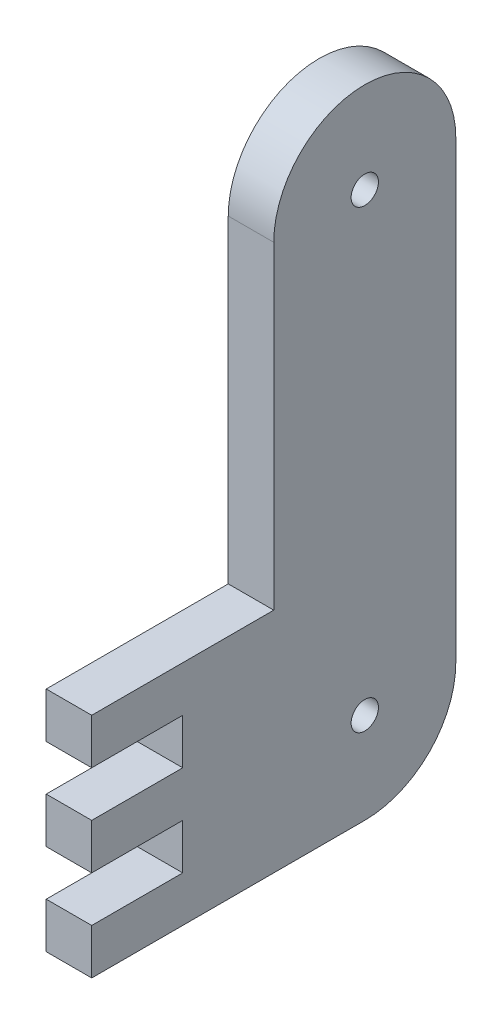
ISO-10303-21;
HEADER;
FILE_DESCRIPTION(('STEP AP214'),'2;1');
FILE_NAME('part.step','',(''),(''),'','','');
FILE_SCHEMA(('AUTOMOTIVE_DESIGN { 1 0 10303 214 1 1 1 1 }'));
ENDSEC;
DATA;
#1=APPLICATION_CONTEXT('core data for automotive mechanical design processes');
#2=APPLICATION_PROTOCOL_DEFINITION('international standard','automotive_design',2000,#1);
#3=PRODUCT_CONTEXT('',#1,'mechanical');
#4=PRODUCT('Part','Part','',(#3));
#5=PRODUCT_RELATED_PRODUCT_CATEGORY('part','',(#4));
#6=PRODUCT_DEFINITION_FORMATION('','',#4);
#7=PRODUCT_DEFINITION_CONTEXT('part definition',#1,'design');
#8=PRODUCT_DEFINITION('design','',#6,#7);
#9=PRODUCT_DEFINITION_SHAPE('','',#8);
#10=(LENGTH_UNIT() NAMED_UNIT(*) SI_UNIT(.MILLI.,.METRE.));
#11=(NAMED_UNIT(*) PLANE_ANGLE_UNIT() SI_UNIT($,.RADIAN.));
#12=(NAMED_UNIT(*) SI_UNIT($,.STERADIAN.) SOLID_ANGLE_UNIT());
#13=UNCERTAINTY_MEASURE_WITH_UNIT(LENGTH_MEASURE(1.E-05),#10,'distance_accuracy_value','');
#14=(GEOMETRIC_REPRESENTATION_CONTEXT(3) GLOBAL_UNCERTAINTY_ASSIGNED_CONTEXT((#13)) GLOBAL_UNIT_ASSIGNED_CONTEXT((#10,
#11,#12)) REPRESENTATION_CONTEXT('',''));
#15=CARTESIAN_POINT('',(0.,0.,0.));
#16=DIRECTION('',(0.,0.,1.));
#17=DIRECTION('',(1.,0.,0.));
#18=AXIS2_PLACEMENT_3D('',#15,#16,#17);
#19=CARTESIAN_POINT('',(5.,15.,30.));
#20=DIRECTION('',(0.,0.,-1.));
#21=DIRECTION('',(0.,1.,0.));
#22=AXIS2_PLACEMENT_3D('',#19,#20,#21);
#23=PLANE('',#22);
#24=DIRECTION('',(0.,-1.,0.));
#25=VECTOR('',#24,1.);
#26=CARTESIAN_POINT('',(0.,15.,30.));
#27=LINE('',#26,#25);
#28=CARTESIAN_POINT('',(0.,15.,30.));
#29=VERTEX_POINT('',#28);
#30=CARTESIAN_POINT('',(0.,10.,30.));
#31=VERTEX_POINT('',#30);
#32=EDGE_CURVE('E268',#29,#31,#27,.T.);
#33=ORIENTED_EDGE('',*,*,#32,.T.);
#34=DIRECTION('',(1.,0.,0.));
#35=VECTOR('',#34,1.);
#36=CARTESIAN_POINT('',(0.,10.,30.));
#37=LINE('',#36,#35);
#38=CARTESIAN_POINT('',(5.,10.,30.));
#39=VERTEX_POINT('',#38);
#40=EDGE_CURVE('E186',#31,#39,#37,.T.);
#41=ORIENTED_EDGE('',*,*,#40,.T.);
#42=DIRECTION('',(0.,-1.,0.));
#43=VECTOR('',#42,1.);
#44=CARTESIAN_POINT('',(5.,15.,30.));
#45=LINE('',#44,#43);
#46=CARTESIAN_POINT('',(5.,15.,30.));
#47=VERTEX_POINT('',#46);
#48=EDGE_CURVE('E243',#47,#39,#45,.T.);
#49=ORIENTED_EDGE('',*,*,#48,.F.);
#50=DIRECTION('',(-1.,0.,0.));
#51=VECTOR('',#50,1.);
#52=CARTESIAN_POINT('',(5.,15.,30.));
#53=LINE('',#52,#51);
#54=EDGE_CURVE('E267',#47,#29,#53,.T.);
#55=ORIENTED_EDGE('',*,*,#54,.T.);
#56=EDGE_LOOP('',(#33,#41,#49,#55));
#57=FACE_BOUND('',#56,.T.);
#58=ADVANCED_FACE('F39',(#57),#23,.F.);
#59=CARTESIAN_POINT('',(5.,5.,30.));
#60=VERTEX_POINT('',#59);
#61=CARTESIAN_POINT('',(5.,0.,30.));
#62=VERTEX_POINT('',#61);
#63=EDGE_CURVE('E248',#60,#62,#45,.T.);
#64=ORIENTED_EDGE('',*,*,#63,.F.);
#65=DIRECTION('',(1.,0.,0.));
#66=VECTOR('',#65,1.);
#67=CARTESIAN_POINT('',(0.,5.,30.));
#68=LINE('',#67,#66);
#69=CARTESIAN_POINT('',(0.,5.,30.));
#70=VERTEX_POINT('',#69);
#71=EDGE_CURVE('E155',#70,#60,#68,.T.);
#72=ORIENTED_EDGE('',*,*,#71,.F.);
#73=CARTESIAN_POINT('',(0.,0.,30.));
#74=VERTEX_POINT('',#73);
#75=EDGE_CURVE('E171',#70,#74,#27,.T.);
#76=ORIENTED_EDGE('',*,*,#75,.T.);
#77=DIRECTION('',(1.,0.,0.));
#78=VECTOR('',#77,1.);
#79=CARTESIAN_POINT('',(0.,0.,30.));
#80=LINE('',#79,#78);
#81=EDGE_CURVE('E183',#74,#62,#80,.T.);
#82=ORIENTED_EDGE('',*,*,#81,.T.);
#83=EDGE_LOOP('',(#64,#72,#76,#82));
#84=FACE_BOUND('',#83,.T.);
#85=ADVANCED_FACE('F346',(#84),#23,.F.);
#86=CARTESIAN_POINT('',(5.,0.,0.));
#87=DIRECTION('',(1.,0.,0.));
#88=DIRECTION('',(0.,0.,-1.));
#89=AXIS2_PLACEMENT_3D('',#86,#87,#88);
#90=PLANE('',#89);
#91=DIRECTION('',(0.,0.,1.));
#92=VECTOR('',#91,1.);
#93=CARTESIAN_POINT('',(5.,10.,30.));
#94=LINE('',#93,#92);
#95=CARTESIAN_POINT('',(5.,10.,20.));
#96=VERTEX_POINT('',#95);
#97=EDGE_CURVE('E173',#96,#39,#94,.T.);
#98=ORIENTED_EDGE('',*,*,#97,.F.);
#99=DIRECTION('',(0.,1.,0.));
#100=VECTOR('',#99,1.);
#101=CARTESIAN_POINT('',(5.,10.,20.));
#102=LINE('',#101,#100);
#103=CARTESIAN_POINT('',(5.,5.,20.));
#104=VERTEX_POINT('',#103);
#105=EDGE_CURVE('E176',#104,#96,#102,.T.);
#106=ORIENTED_EDGE('',*,*,#105,.F.);
#107=DIRECTION('',(0.,0.,-1.));
#108=VECTOR('',#107,1.);
#109=CARTESIAN_POINT('',(5.,5.,30.));
#110=LINE('',#109,#108);
#111=EDGE_CURVE('E149',#60,#104,#110,.T.);
#112=ORIENTED_EDGE('',*,*,#111,.F.);
#113=ORIENTED_EDGE('',*,*,#63,.T.);
#114=DIRECTION('',(0.,0.,1.));
#115=VECTOR('',#114,1.);
#116=CARTESIAN_POINT('',(5.,0.,30.));
#117=LINE('',#116,#115);
#118=CARTESIAN_POINT('',(5.,0.,20.));
#119=VERTEX_POINT('',#118);
#120=EDGE_CURVE('E198',#119,#62,#117,.T.);
#121=ORIENTED_EDGE('',*,*,#120,.F.);
#122=DIRECTION('',(0.,1.,0.));
#123=VECTOR('',#122,1.);
#124=CARTESIAN_POINT('',(5.,0.,20.));
#125=LINE('',#124,#123);
#126=CARTESIAN_POINT('',(5.,-5.,20.));
#127=VERTEX_POINT('',#126);
#128=EDGE_CURVE('E210',#127,#119,#125,.T.);
#129=ORIENTED_EDGE('',*,*,#128,.F.);
#130=DIRECTION('',(0.,0.,-1.));
#131=VECTOR('',#130,1.);
#132=CARTESIAN_POINT('',(5.,-5.,30.));
#133=LINE('',#132,#131);
#134=CARTESIAN_POINT('',(5.,-5.,30.));
#135=VERTEX_POINT('',#134);
#136=EDGE_CURVE('E206',#135,#127,#133,.T.);
#137=ORIENTED_EDGE('',*,*,#136,.F.);
#138=CARTESIAN_POINT('',(5.,-10.,30.));
#139=VERTEX_POINT('',#138);
#140=EDGE_CURVE('E249',#135,#139,#45,.T.);
#141=ORIENTED_EDGE('',*,*,#140,.T.);
#142=DIRECTION('',(0.,0.,-1.));
#143=VECTOR('',#142,1.);
#144=CARTESIAN_POINT('',(5.,-10.,0.));
#145=LINE('',#144,#143);
#146=CARTESIAN_POINT('',(5.,-10.,0.));
#147=VERTEX_POINT('',#146);
#148=EDGE_CURVE('E247',#139,#147,#145,.T.);
#149=ORIENTED_EDGE('',*,*,#148,.T.);
#150=CARTESIAN_POINT('',(5.,0.,0.));
#151=DIRECTION('',(1.,0.,0.));
#152=DIRECTION('',(0.,0.,-1.));
#153=AXIS2_PLACEMENT_3D('',#150,#151,#152);
#154=CIRCLE('',#153,10.);
#155=CARTESIAN_POINT('',(5.,0.,-10.));
#156=VERTEX_POINT('',#155);
#157=EDGE_CURVE('E252',#147,#156,#154,.T.);
#158=ORIENTED_EDGE('',*,*,#157,.T.);
#159=DIRECTION('',(0.,1.,0.));
#160=VECTOR('',#159,1.);
#161=CARTESIAN_POINT('',(5.,50.,-10.));
#162=LINE('',#161,#160);
#163=CARTESIAN_POINT('',(5.,50.,-10.));
#164=VERTEX_POINT('',#163);
#165=EDGE_CURVE('E255',#156,#164,#162,.T.);
#166=ORIENTED_EDGE('',*,*,#165,.T.);
#167=CARTESIAN_POINT('',(5.,50.,0.));
#168=DIRECTION('',(1.,0.,0.));
#169=DIRECTION('',(0.,0.,-1.));
#170=AXIS2_PLACEMENT_3D('',#167,#168,#169);
#171=CIRCLE('',#170,10.);
#172=CARTESIAN_POINT('',(5.,50.,10.));
#173=VERTEX_POINT('',#172);
#174=EDGE_CURVE('E258',#164,#173,#171,.T.);
#175=ORIENTED_EDGE('',*,*,#174,.T.);
#176=DIRECTION('',(0.,-1.,0.));
#177=VECTOR('',#176,1.);
#178=CARTESIAN_POINT('',(5.,50.,10.));
#179=LINE('',#178,#177);
#180=CARTESIAN_POINT('',(5.,15.,10.));
#181=VERTEX_POINT('',#180);
#182=EDGE_CURVE('E261',#173,#181,#179,.T.);
#183=ORIENTED_EDGE('',*,*,#182,.T.);
#184=DIRECTION('',(0.,0.,1.));
#185=VECTOR('',#184,1.);
#186=CARTESIAN_POINT('',(5.,15.,10.));
#187=LINE('',#186,#185);
#188=EDGE_CURVE('E264',#181,#47,#187,.T.);
#189=ORIENTED_EDGE('',*,*,#188,.T.);
#190=ORIENTED_EDGE('',*,*,#48,.T.);
#191=EDGE_LOOP('',(#98,#106,#112,#113,#121,#129,#137,#141,#149,#158,#166,#175,#183,#189,#190));
#192=FACE_BOUND('',#191,.T.);
#193=CARTESIAN_POINT('',(5.,50.,0.));
#194=DIRECTION('',(1.,0.,0.));
#195=DIRECTION('',(0.,0.,-1.));
#196=AXIS2_PLACEMENT_3D('',#193,#194,#195);
#197=CIRCLE('',#196,1.5);
#198=CARTESIAN_POINT('',(5.,50.,-1.5));
#199=VERTEX_POINT('',#198);
#200=EDGE_CURVE('E235',#199,#199,#197,.T.);
#201=ORIENTED_EDGE('',*,*,#200,.F.);
#202=EDGE_LOOP('',(#201));
#203=FACE_BOUND('',#202,.T.);
#204=CARTESIAN_POINT('',(5.,0.,0.));
#205=DIRECTION('',(1.,0.,0.));
#206=DIRECTION('',(0.,0.,-1.));
#207=AXIS2_PLACEMENT_3D('',#204,#205,#206);
#208=CIRCLE('',#207,1.5);
#209=CARTESIAN_POINT('',(5.,0.,-1.5));
#210=VERTEX_POINT('',#209);
#211=EDGE_CURVE('E227',#210,#210,#208,.T.);
#212=ORIENTED_EDGE('',*,*,#211,.F.);
#213=EDGE_LOOP('',(#212));
#214=FACE_BOUND('',#213,.T.);
#215=ADVANCED_FACE('F334',(#192,#203,#214),#90,.T.);
#216=CARTESIAN_POINT('',(0.,0.,0.));
#217=DIRECTION('',(1.,0.,0.));
#218=DIRECTION('',(0.,0.,-1.));
#219=AXIS2_PLACEMENT_3D('',#216,#217,#218);
#220=PLANE('',#219);
#221=DIRECTION('',(0.,1.,0.));
#222=VECTOR('',#221,1.);
#223=CARTESIAN_POINT('',(0.,10.,20.));
#224=LINE('',#223,#222);
#225=CARTESIAN_POINT('',(0.,5.,20.));
#226=VERTEX_POINT('',#225);
#227=CARTESIAN_POINT('',(0.,10.,20.));
#228=VERTEX_POINT('',#227);
#229=EDGE_CURVE('E158',#226,#228,#224,.T.);
#230=ORIENTED_EDGE('',*,*,#229,.T.);
#231=DIRECTION('',(0.,0.,1.));
#232=VECTOR('',#231,1.);
#233=CARTESIAN_POINT('',(0.,10.,30.));
#234=LINE('',#233,#232);
#235=EDGE_CURVE('E164',#228,#31,#234,.T.);
#236=ORIENTED_EDGE('',*,*,#235,.T.);
#237=ORIENTED_EDGE('',*,*,#32,.F.);
#238=DIRECTION('',(0.,0.,1.));
#239=VECTOR('',#238,1.);
#240=CARTESIAN_POINT('',(0.,15.,10.));
#241=LINE('',#240,#239);
#242=CARTESIAN_POINT('',(0.,15.,10.));
#243=VERTEX_POINT('',#242);
#244=EDGE_CURVE('E287',#243,#29,#241,.T.);
#245=ORIENTED_EDGE('',*,*,#244,.F.);
#246=DIRECTION('',(0.,-1.,0.));
#247=VECTOR('',#246,1.);
#248=CARTESIAN_POINT('',(0.,50.,10.));
#249=LINE('',#248,#247);
#250=CARTESIAN_POINT('',(0.,50.,10.));
#251=VERTEX_POINT('',#250);
#252=EDGE_CURVE('E284',#251,#243,#249,.T.);
#253=ORIENTED_EDGE('',*,*,#252,.F.);
#254=CARTESIAN_POINT('',(0.,50.,0.));
#255=DIRECTION('',(1.,0.,0.));
#256=DIRECTION('',(0.,0.,-1.));
#257=AXIS2_PLACEMENT_3D('',#254,#255,#256);
#258=CIRCLE('',#257,10.);
#259=CARTESIAN_POINT('',(0.,50.,-10.));
#260=VERTEX_POINT('',#259);
#261=EDGE_CURVE('E281',#260,#251,#258,.T.);
#262=ORIENTED_EDGE('',*,*,#261,.F.);
#263=DIRECTION('',(0.,1.,0.));
#264=VECTOR('',#263,1.);
#265=CARTESIAN_POINT('',(0.,50.,-10.));
#266=LINE('',#265,#264);
#267=CARTESIAN_POINT('',(0.,0.,-10.));
#268=VERTEX_POINT('',#267);
#269=EDGE_CURVE('E278',#268,#260,#266,.T.);
#270=ORIENTED_EDGE('',*,*,#269,.F.);
#271=CARTESIAN_POINT('',(0.,0.,0.));
#272=DIRECTION('',(1.,0.,0.));
#273=DIRECTION('',(0.,0.,-1.));
#274=AXIS2_PLACEMENT_3D('',#271,#272,#273);
#275=CIRCLE('',#274,10.);
#276=CARTESIAN_POINT('',(0.,-10.,0.));
#277=VERTEX_POINT('',#276);
#278=EDGE_CURVE('E275',#277,#268,#275,.T.);
#279=ORIENTED_EDGE('',*,*,#278,.F.);
#280=DIRECTION('',(0.,0.,-1.));
#281=VECTOR('',#280,1.);
#282=CARTESIAN_POINT('',(0.,-10.,0.));
#283=LINE('',#282,#281);
#284=CARTESIAN_POINT('',(0.,-10.,30.));
#285=VERTEX_POINT('',#284);
#286=EDGE_CURVE('E272',#285,#277,#283,.T.);
#287=ORIENTED_EDGE('',*,*,#286,.F.);
#288=CARTESIAN_POINT('',(0.,-5.,30.));
#289=VERTEX_POINT('',#288);
#290=EDGE_CURVE('E239',#289,#285,#27,.T.);
#291=ORIENTED_EDGE('',*,*,#290,.F.);
#292=DIRECTION('',(0.,0.,-1.));
#293=VECTOR('',#292,1.);
#294=CARTESIAN_POINT('',(0.,-5.,30.));
#295=LINE('',#294,#293);
#296=CARTESIAN_POINT('',(0.,-5.,20.));
#297=VERTEX_POINT('',#296);
#298=EDGE_CURVE('E55',#289,#297,#295,.T.);
#299=ORIENTED_EDGE('',*,*,#298,.T.);
#300=DIRECTION('',(0.,1.,0.));
#301=VECTOR('',#300,1.);
#302=CARTESIAN_POINT('',(0.,0.,20.));
#303=LINE('',#302,#301);
#304=CARTESIAN_POINT('',(0.,0.,20.));
#305=VERTEX_POINT('',#304);
#306=EDGE_CURVE('E197',#297,#305,#303,.T.);
#307=ORIENTED_EDGE('',*,*,#306,.T.);
#308=DIRECTION('',(0.,0.,1.));
#309=VECTOR('',#308,1.);
#310=CARTESIAN_POINT('',(0.,0.,30.));
#311=LINE('',#310,#309);
#312=EDGE_CURVE('E202',#305,#74,#311,.T.);
#313=ORIENTED_EDGE('',*,*,#312,.T.);
#314=ORIENTED_EDGE('',*,*,#75,.F.);
#315=DIRECTION('',(0.,0.,-1.));
#316=VECTOR('',#315,1.);
#317=CARTESIAN_POINT('',(0.,5.,30.));
#318=LINE('',#317,#316);
#319=EDGE_CURVE('E63',#70,#226,#318,.T.);
#320=ORIENTED_EDGE('',*,*,#319,.T.);
#321=EDGE_LOOP('',(#230,#236,#237,#245,#253,#262,#270,#279,#287,#291,#299,#307,#313,#314,#320));
#322=FACE_BOUND('',#321,.T.);
#323=CARTESIAN_POINT('',(0.,50.,0.));
#324=DIRECTION('',(1.,0.,0.));
#325=DIRECTION('',(0.,0.,-1.));
#326=AXIS2_PLACEMENT_3D('',#323,#324,#325);
#327=CIRCLE('',#326,1.5);
#328=CARTESIAN_POINT('',(0.,50.,-1.5));
#329=VERTEX_POINT('',#328);
#330=EDGE_CURVE('E231',#329,#329,#327,.T.);
#331=ORIENTED_EDGE('',*,*,#330,.T.);
#332=EDGE_LOOP('',(#331));
#333=FACE_BOUND('',#332,.T.);
#334=CARTESIAN_POINT('',(0.,0.,0.));
#335=DIRECTION('',(1.,0.,0.));
#336=DIRECTION('',(0.,0.,-1.));
#337=AXIS2_PLACEMENT_3D('',#334,#335,#336);
#338=CIRCLE('',#337,1.5);
#339=CARTESIAN_POINT('',(0.,0.,-1.5));
#340=VERTEX_POINT('',#339);
#341=EDGE_CURVE('E190',#340,#340,#338,.T.);
#342=ORIENTED_EDGE('',*,*,#341,.T.);
#343=EDGE_LOOP('',(#342));
#344=FACE_BOUND('',#343,.T.);
#345=ADVANCED_FACE('F167',(#322,#333,#344),#220,.F.);
#346=ORIENTED_EDGE('',*,*,#140,.F.);
#347=DIRECTION('',(1.,0.,0.));
#348=VECTOR('',#347,1.);
#349=CARTESIAN_POINT('',(0.,-5.,30.));
#350=LINE('',#349,#348);
#351=EDGE_CURVE('E205',#289,#135,#350,.T.);
#352=ORIENTED_EDGE('',*,*,#351,.F.);
#353=ORIENTED_EDGE('',*,*,#290,.T.);
#354=DIRECTION('',(-1.,0.,0.));
#355=VECTOR('',#354,1.);
#356=CARTESIAN_POINT('',(5.,-10.,30.));
#357=LINE('',#356,#355);
#358=EDGE_CURVE('E11',#139,#285,#357,.T.);
#359=ORIENTED_EDGE('',*,*,#358,.F.);
#360=EDGE_LOOP('',(#346,#352,#353,#359));
#361=FACE_BOUND('',#360,.T.);
#362=ADVANCED_FACE('F41',(#361),#23,.F.);
#363=CARTESIAN_POINT('',(5.,-10.,0.));
#364=DIRECTION('',(0.,1.,0.));
#365=DIRECTION('',(0.,0.,1.));
#366=AXIS2_PLACEMENT_3D('',#363,#364,#365);
#367=PLANE('',#366);
#368=ORIENTED_EDGE('',*,*,#286,.T.);
#369=DIRECTION('',(-1.,0.,0.));
#370=VECTOR('',#369,1.);
#371=CARTESIAN_POINT('',(5.,-10.,0.));
#372=LINE('',#371,#370);
#373=EDGE_CURVE('E48',#147,#277,#372,.T.);
#374=ORIENTED_EDGE('',*,*,#373,.F.);
#375=ORIENTED_EDGE('',*,*,#148,.F.);
#376=ORIENTED_EDGE('',*,*,#358,.T.);
#377=EDGE_LOOP('',(#368,#374,#375,#376));
#378=FACE_BOUND('',#377,.T.);
#379=ADVANCED_FACE('F340',(#378),#367,.F.);
#380=CARTESIAN_POINT('',(5.,0.,0.));
#381=DIRECTION('',(-1.,0.,0.));
#382=DIRECTION('',(0.,0.,1.));
#383=AXIS2_PLACEMENT_3D('',#380,#381,#382);
#384=CYLINDRICAL_SURFACE('',#383,10.);
#385=ORIENTED_EDGE('',*,*,#278,.T.);
#386=DIRECTION('',(-1.,0.,0.));
#387=VECTOR('',#386,1.);
#388=CARTESIAN_POINT('',(5.,0.,-10.));
#389=LINE('',#388,#387);
#390=EDGE_CURVE('E305',#156,#268,#389,.T.);
#391=ORIENTED_EDGE('',*,*,#390,.F.);
#392=ORIENTED_EDGE('',*,*,#157,.F.);
#393=ORIENTED_EDGE('',*,*,#373,.T.);
#394=EDGE_LOOP('',(#385,#391,#392,#393));
#395=FACE_BOUND('',#394,.T.);
#396=ADVANCED_FACE('F314',(#395),#384,.T.);
#397=CARTESIAN_POINT('',(5.,50.,-10.));
#398=DIRECTION('',(0.,0.,1.));
#399=DIRECTION('',(1.,0.,0.));
#400=AXIS2_PLACEMENT_3D('',#397,#398,#399);
#401=PLANE('',#400);
#402=ORIENTED_EDGE('',*,*,#269,.T.);
#403=DIRECTION('',(-1.,0.,0.));
#404=VECTOR('',#403,1.);
#405=CARTESIAN_POINT('',(5.,50.,-10.));
#406=LINE('',#405,#404);
#407=EDGE_CURVE('E301',#164,#260,#406,.T.);
#408=ORIENTED_EDGE('',*,*,#407,.F.);
#409=ORIENTED_EDGE('',*,*,#165,.F.);
#410=ORIENTED_EDGE('',*,*,#390,.T.);
#411=EDGE_LOOP('',(#402,#408,#409,#410));
#412=FACE_BOUND('',#411,.T.);
#413=ADVANCED_FACE('F325',(#412),#401,.F.);
#414=CARTESIAN_POINT('',(5.,50.,0.));
#415=DIRECTION('',(-1.,0.,0.));
#416=DIRECTION('',(0.,0.,1.));
#417=AXIS2_PLACEMENT_3D('',#414,#415,#416);
#418=CYLINDRICAL_SURFACE('',#417,10.);
#419=ORIENTED_EDGE('',*,*,#261,.T.);
#420=DIRECTION('',(-1.,0.,0.));
#421=VECTOR('',#420,1.);
#422=CARTESIAN_POINT('',(5.,50.,10.));
#423=LINE('',#422,#421);
#424=EDGE_CURVE('E297',#173,#251,#423,.T.);
#425=ORIENTED_EDGE('',*,*,#424,.F.);
#426=ORIENTED_EDGE('',*,*,#174,.F.);
#427=ORIENTED_EDGE('',*,*,#407,.T.);
#428=EDGE_LOOP('',(#419,#425,#426,#427));
#429=FACE_BOUND('',#428,.T.);
#430=ADVANCED_FACE('F329',(#429),#418,.T.);
#431=CARTESIAN_POINT('',(5.,50.,10.));
#432=DIRECTION('',(0.,0.,-1.));
#433=DIRECTION('',(0.,1.,0.));
#434=AXIS2_PLACEMENT_3D('',#431,#432,#433);
#435=PLANE('',#434);
#436=ORIENTED_EDGE('',*,*,#252,.T.);
#437=DIRECTION('',(-1.,0.,0.));
#438=VECTOR('',#437,1.);
#439=CARTESIAN_POINT('',(5.,15.,10.));
#440=LINE('',#439,#438);
#441=EDGE_CURVE('E293',#181,#243,#440,.T.);
#442=ORIENTED_EDGE('',*,*,#441,.F.);
#443=ORIENTED_EDGE('',*,*,#182,.F.);
#444=ORIENTED_EDGE('',*,*,#424,.T.);
#445=EDGE_LOOP('',(#436,#442,#443,#444));
#446=FACE_BOUND('',#445,.T.);
#447=ADVANCED_FACE('F360',(#446),#435,.F.);
#448=CARTESIAN_POINT('',(5.,15.,10.));
#449=DIRECTION('',(0.,-1.,0.));
#450=DIRECTION('',(0.,0.,-1.));
#451=AXIS2_PLACEMENT_3D('',#448,#449,#450);
#452=PLANE('',#451);
#453=ORIENTED_EDGE('',*,*,#244,.T.);
#454=ORIENTED_EDGE('',*,*,#54,.F.);
#455=ORIENTED_EDGE('',*,*,#188,.F.);
#456=ORIENTED_EDGE('',*,*,#441,.T.);
#457=EDGE_LOOP('',(#453,#454,#455,#456));
#458=FACE_BOUND('',#457,.T.);
#459=ADVANCED_FACE('F357',(#458),#452,.F.);
#460=CARTESIAN_POINT('',(5.,50.,0.));
#461=DIRECTION('',(-1.,0.,0.));
#462=DIRECTION('',(0.,0.,1.));
#463=AXIS2_PLACEMENT_3D('',#460,#461,#462);
#464=CYLINDRICAL_SURFACE('',#463,1.5);
#465=ORIENTED_EDGE('',*,*,#200,.T.);
#466=EDGE_LOOP('',(#465));
#467=FACE_BOUND('',#466,.T.);
#468=ORIENTED_EDGE('',*,*,#330,.F.);
#469=EDGE_LOOP('',(#468));
#470=FACE_BOUND('',#469,.T.);
#471=ADVANCED_FACE('F367',(#467,#470),#464,.F.);
#472=CARTESIAN_POINT('',(5.,0.,0.));
#473=DIRECTION('',(-1.,0.,0.));
#474=DIRECTION('',(0.,0.,1.));
#475=AXIS2_PLACEMENT_3D('',#472,#473,#474);
#476=CYLINDRICAL_SURFACE('',#475,1.5);
#477=ORIENTED_EDGE('',*,*,#211,.T.);
#478=EDGE_LOOP('',(#477));
#479=FACE_BOUND('',#478,.T.);
#480=ORIENTED_EDGE('',*,*,#341,.F.);
#481=EDGE_LOOP('',(#480));
#482=FACE_BOUND('',#481,.T.);
#483=ADVANCED_FACE('F387',(#479,#482),#476,.F.);
#484=CARTESIAN_POINT('',(0.,0.,30.));
#485=DIRECTION('',(0.,1.,0.));
#486=DIRECTION('',(0.,0.,1.));
#487=AXIS2_PLACEMENT_3D('',#484,#485,#486);
#488=PLANE('',#487);
#489=ORIENTED_EDGE('',*,*,#120,.T.);
#490=ORIENTED_EDGE('',*,*,#81,.F.);
#491=ORIENTED_EDGE('',*,*,#312,.F.);
#492=DIRECTION('',(1.,0.,0.));
#493=VECTOR('',#492,1.);
#494=CARTESIAN_POINT('',(0.,0.,20.));
#495=LINE('',#494,#493);
#496=EDGE_CURVE('E219',#305,#119,#495,.T.);
#497=ORIENTED_EDGE('',*,*,#496,.T.);
#498=EDGE_LOOP('',(#489,#490,#491,#497));
#499=FACE_BOUND('',#498,.T.);
#500=ADVANCED_FACE('F391',(#499),#488,.F.);
#501=CARTESIAN_POINT('',(0.,0.,20.));
#502=DIRECTION('',(0.,0.,-1.));
#503=DIRECTION('',(-1.,0.,0.));
#504=AXIS2_PLACEMENT_3D('',#501,#502,#503);
#505=PLANE('',#504);
#506=ORIENTED_EDGE('',*,*,#128,.T.);
#507=ORIENTED_EDGE('',*,*,#496,.F.);
#508=ORIENTED_EDGE('',*,*,#306,.F.);
#509=DIRECTION('',(1.,0.,0.));
#510=VECTOR('',#509,1.);
#511=CARTESIAN_POINT('',(0.,-5.,20.));
#512=LINE('',#511,#510);
#513=EDGE_CURVE('E222',#297,#127,#512,.T.);
#514=ORIENTED_EDGE('',*,*,#513,.T.);
#515=EDGE_LOOP('',(#506,#507,#508,#514));
#516=FACE_BOUND('',#515,.T.);
#517=ADVANCED_FACE('F396',(#516),#505,.F.);
#518=CARTESIAN_POINT('',(0.,-5.,30.));
#519=DIRECTION('',(0.,-1.,0.));
#520=DIRECTION('',(0.,0.,-1.));
#521=AXIS2_PLACEMENT_3D('',#518,#519,#520);
#522=PLANE('',#521);
#523=ORIENTED_EDGE('',*,*,#136,.T.);
#524=ORIENTED_EDGE('',*,*,#513,.F.);
#525=ORIENTED_EDGE('',*,*,#298,.F.);
#526=ORIENTED_EDGE('',*,*,#351,.T.);
#527=EDGE_LOOP('',(#523,#524,#525,#526));
#528=FACE_BOUND('',#527,.T.);
#529=ADVANCED_FACE('F393',(#528),#522,.F.);
#530=CARTESIAN_POINT('',(0.,10.,30.));
#531=DIRECTION('',(0.,1.,0.));
#532=DIRECTION('',(0.,0.,1.));
#533=AXIS2_PLACEMENT_3D('',#530,#531,#532);
#534=PLANE('',#533);
#535=ORIENTED_EDGE('',*,*,#97,.T.);
#536=ORIENTED_EDGE('',*,*,#40,.F.);
#537=ORIENTED_EDGE('',*,*,#235,.F.);
#538=DIRECTION('',(1.,0.,0.));
#539=VECTOR('',#538,1.);
#540=CARTESIAN_POINT('',(0.,10.,20.));
#541=LINE('',#540,#539);
#542=EDGE_CURVE('E154',#228,#96,#541,.T.);
#543=ORIENTED_EDGE('',*,*,#542,.T.);
#544=EDGE_LOOP('',(#535,#536,#537,#543));
#545=FACE_BOUND('',#544,.T.);
#546=ADVANCED_FACE('F351',(#545),#534,.F.);
#547=CARTESIAN_POINT('',(0.,10.,20.));
#548=DIRECTION('',(0.,0.,-1.));
#549=DIRECTION('',(-1.,0.,0.));
#550=AXIS2_PLACEMENT_3D('',#547,#548,#549);
#551=PLANE('',#550);
#552=ORIENTED_EDGE('',*,*,#105,.T.);
#553=ORIENTED_EDGE('',*,*,#542,.F.);
#554=ORIENTED_EDGE('',*,*,#229,.F.);
#555=DIRECTION('',(1.,0.,0.));
#556=VECTOR('',#555,1.);
#557=CARTESIAN_POINT('',(0.,5.,20.));
#558=LINE('',#557,#556);
#559=EDGE_CURVE('E145',#226,#104,#558,.T.);
#560=ORIENTED_EDGE('',*,*,#559,.T.);
#561=EDGE_LOOP('',(#552,#553,#554,#560));
#562=FACE_BOUND('',#561,.T.);
#563=ADVANCED_FACE('F159',(#562),#551,.F.);
#564=CARTESIAN_POINT('',(0.,5.,30.));
#565=DIRECTION('',(0.,-1.,0.));
#566=DIRECTION('',(0.,0.,-1.));
#567=AXIS2_PLACEMENT_3D('',#564,#565,#566);
#568=PLANE('',#567);
#569=ORIENTED_EDGE('',*,*,#111,.T.);
#570=ORIENTED_EDGE('',*,*,#559,.F.);
#571=ORIENTED_EDGE('',*,*,#319,.F.);
#572=ORIENTED_EDGE('',*,*,#71,.T.);
#573=EDGE_LOOP('',(#569,#570,#571,#572));
#574=FACE_BOUND('',#573,.T.);
#575=ADVANCED_FACE('F147',(#574),#568,.F.);
#576=CLOSED_SHELL('',(#58,#85,#215,#345,#362,#379,#396,#413,#430,#447,#459,#471,#483,#500,#517,
#529,#546,#563,#575));
#577=MANIFOLD_SOLID_BREP('B2',#576);
#578=ADVANCED_BREP_SHAPE_REPRESENTATION('',(#18,#577),#14);
#579=SHAPE_DEFINITION_REPRESENTATION(#9,#578);
ENDSEC;
END-ISO-10303-21;
